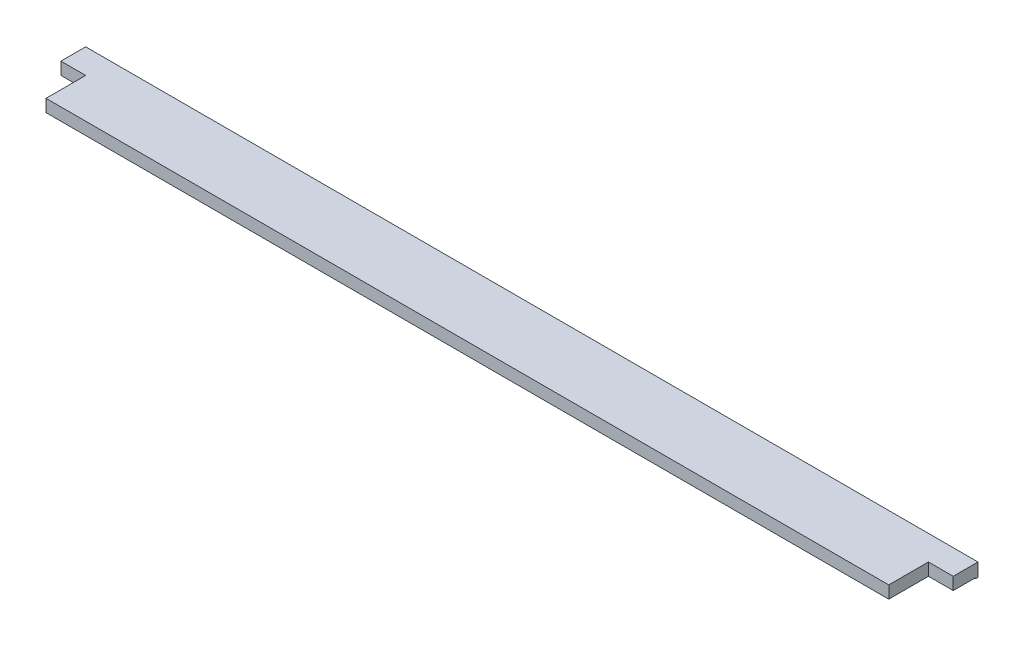
ISO-10303-21;
HEADER;
FILE_DESCRIPTION(('STEP AP214'),'2;1');
FILE_NAME('part.step','',(''),(''),'','','');
FILE_SCHEMA(('AUTOMOTIVE_DESIGN { 1 0 10303 214 1 1 1 1 }'));
ENDSEC;
DATA;
#1=APPLICATION_CONTEXT('core data for automotive mechanical design processes');
#2=APPLICATION_PROTOCOL_DEFINITION('international standard','automotive_design',2000,#1);
#3=PRODUCT_CONTEXT('',#1,'mechanical');
#4=PRODUCT('Part','Part','',(#3));
#5=PRODUCT_RELATED_PRODUCT_CATEGORY('part','',(#4));
#6=PRODUCT_DEFINITION_FORMATION('','',#4);
#7=PRODUCT_DEFINITION_CONTEXT('part definition',#1,'design');
#8=PRODUCT_DEFINITION('design','',#6,#7);
#9=PRODUCT_DEFINITION_SHAPE('','',#8);
#10=(LENGTH_UNIT() NAMED_UNIT(*) SI_UNIT(.MILLI.,.METRE.));
#11=(NAMED_UNIT(*) PLANE_ANGLE_UNIT() SI_UNIT($,.RADIAN.));
#12=(NAMED_UNIT(*) SI_UNIT($,.STERADIAN.) SOLID_ANGLE_UNIT());
#13=UNCERTAINTY_MEASURE_WITH_UNIT(LENGTH_MEASURE(1.E-05),#10,'distance_accuracy_value','');
#14=(GEOMETRIC_REPRESENTATION_CONTEXT(3) GLOBAL_UNCERTAINTY_ASSIGNED_CONTEXT((#13)) GLOBAL_UNIT_ASSIGNED_CONTEXT((#10,
#11,#12)) REPRESENTATION_CONTEXT('',''));
#15=CARTESIAN_POINT('',(0.,0.,0.));
#16=DIRECTION('',(0.,0.,1.));
#17=DIRECTION('',(1.,0.,0.));
#18=AXIS2_PLACEMENT_3D('',#15,#16,#17);
#19=CARTESIAN_POINT('',(1800.,-25.,0.));
#20=DIRECTION('',(0.,0.,-1.));
#21=DIRECTION('',(-1.,0.,0.));
#22=AXIS2_PLACEMENT_3D('',#19,#20,#21);
#23=PLANE('',#22);
#24=DIRECTION('',(-1.,0.,0.));
#25=VECTOR('',#24,1.);
#26=CARTESIAN_POINT('',(1800.,0.,0.));
#27=LINE('',#26,#25);
#28=CARTESIAN_POINT('',(1750.,0.,0.));
#29=VERTEX_POINT('',#28);
#30=CARTESIAN_POINT('',(50.,0.,0.));
#31=VERTEX_POINT('',#30);
#32=EDGE_CURVE('E129',#29,#31,#27,.T.);
#33=ORIENTED_EDGE('',*,*,#32,.T.);
#34=DIRECTION('',(0.,1.,0.));
#35=VECTOR('',#34,1.);
#36=CARTESIAN_POINT('',(50.,-27.,0.));
#37=LINE('',#36,#35);
#38=CARTESIAN_POINT('',(50.,-25.,0.));
#39=VERTEX_POINT('',#38);
#40=EDGE_CURVE('E111',#39,#31,#37,.T.);
#41=ORIENTED_EDGE('',*,*,#40,.F.);
#42=DIRECTION('',(-1.,0.,0.));
#43=VECTOR('',#42,1.);
#44=CARTESIAN_POINT('',(1800.,-25.,0.));
#45=LINE('',#44,#43);
#46=CARTESIAN_POINT('',(1750.,-25.,0.));
#47=VERTEX_POINT('',#46);
#48=EDGE_CURVE('E154',#47,#39,#45,.T.);
#49=ORIENTED_EDGE('',*,*,#48,.F.);
#50=DIRECTION('',(0.,1.,0.));
#51=VECTOR('',#50,1.);
#52=CARTESIAN_POINT('',(1750.,-27.,0.));
#53=LINE('',#52,#51);
#54=EDGE_CURVE('E130',#47,#29,#53,.T.);
#55=ORIENTED_EDGE('',*,*,#54,.T.);
#56=EDGE_LOOP('',(#33,#41,#49,#55));
#57=FACE_BOUND('',#56,.T.);
#58=ADVANCED_FACE('F35',(#57),#23,.F.);
#59=CARTESIAN_POINT('',(1800.,-25.,-125.));
#60=DIRECTION('',(0.,1.,0.));
#61=DIRECTION('',(0.,0.,1.));
#62=AXIS2_PLACEMENT_3D('',#59,#60,#61);
#63=PLANE('',#62);
#64=DIRECTION('',(0.,0.,-1.));
#65=VECTOR('',#64,1.);
#66=CARTESIAN_POINT('',(50.,-25.,-125.));
#67=LINE('',#66,#65);
#68=CARTESIAN_POINT('',(50.,-25.,-80.));
#69=VERTEX_POINT('',#68);
#70=EDGE_CURVE('E117',#39,#69,#67,.T.);
#71=ORIENTED_EDGE('',*,*,#70,.T.);
#72=DIRECTION('',(-1.,0.,0.));
#73=VECTOR('',#72,1.);
#74=CARTESIAN_POINT('',(1800.,-25.,-80.));
#75=LINE('',#74,#73);
#76=CARTESIAN_POINT('',(0.,-25.,-80.));
#77=VERTEX_POINT('',#76);
#78=EDGE_CURVE('E157',#69,#77,#75,.T.);
#79=ORIENTED_EDGE('',*,*,#78,.T.);
#80=DIRECTION('',(0.,0.,-1.));
#81=VECTOR('',#80,1.);
#82=CARTESIAN_POINT('',(0.,-25.,-125.));
#83=LINE('',#82,#81);
#84=CARTESIAN_POINT('',(0.,-25.,-125.));
#85=VERTEX_POINT('',#84);
#86=EDGE_CURVE('E164',#77,#85,#83,.T.);
#87=ORIENTED_EDGE('',*,*,#86,.T.);
#88=DIRECTION('',(-1.,0.,0.));
#89=VECTOR('',#88,1.);
#90=CARTESIAN_POINT('',(1800.,-25.,-125.));
#91=LINE('',#90,#89);
#92=CARTESIAN_POINT('',(1800.,-25.,-125.));
#93=VERTEX_POINT('',#92);
#94=EDGE_CURVE('E151',#93,#85,#91,.T.);
#95=ORIENTED_EDGE('',*,*,#94,.F.);
#96=DIRECTION('',(0.,0.,-1.));
#97=VECTOR('',#96,1.);
#98=CARTESIAN_POINT('',(1800.,-25.,-125.));
#99=LINE('',#98,#97);
#100=CARTESIAN_POINT('',(1800.,-25.,-80.));
#101=VERTEX_POINT('',#100);
#102=EDGE_CURVE('E181',#101,#93,#99,.T.);
#103=ORIENTED_EDGE('',*,*,#102,.F.);
#104=DIRECTION('',(-1.,0.,0.));
#105=VECTOR('',#104,1.);
#106=CARTESIAN_POINT('',(1800.,-25.,-80.));
#107=LINE('',#106,#105);
#108=CARTESIAN_POINT('',(1750.,-25.,-80.));
#109=VERTEX_POINT('',#108);
#110=EDGE_CURVE('E49',#101,#109,#107,.T.);
#111=ORIENTED_EDGE('',*,*,#110,.T.);
#112=DIRECTION('',(0.,0.,1.));
#113=VECTOR('',#112,1.);
#114=CARTESIAN_POINT('',(1750.,-25.,-125.));
#115=LINE('',#114,#113);
#116=EDGE_CURVE('E173',#109,#47,#115,.T.);
#117=ORIENTED_EDGE('',*,*,#116,.T.);
#118=ORIENTED_EDGE('',*,*,#48,.T.);
#119=EDGE_LOOP('',(#71,#79,#87,#95,#103,#111,#117,#118));
#120=FACE_BOUND('',#119,.T.);
#121=ADVANCED_FACE('F162',(#120),#63,.F.);
#122=CARTESIAN_POINT('',(1800.,-27.,-125.));
#123=DIRECTION('',(0.,0.,-1.));
#124=DIRECTION('',(-1.,0.,0.));
#125=AXIS2_PLACEMENT_3D('',#122,#123,#124);
#126=PLANE('',#125);
#127=DIRECTION('',(0.,-1.,0.));
#128=VECTOR('',#127,1.);
#129=CARTESIAN_POINT('',(0.,-27.,-125.));
#130=LINE('',#129,#128);
#131=CARTESIAN_POINT('',(0.,-27.,-125.));
#132=VERTEX_POINT('',#131);
#133=EDGE_CURVE('E169',#85,#132,#130,.T.);
#134=ORIENTED_EDGE('',*,*,#133,.T.);
#135=DIRECTION('',(-1.,0.,0.));
#136=VECTOR('',#135,1.);
#137=CARTESIAN_POINT('',(1800.,-27.,-125.));
#138=LINE('',#137,#136);
#139=CARTESIAN_POINT('',(1800.,-27.,-125.));
#140=VERTEX_POINT('',#139);
#141=EDGE_CURVE('E148',#140,#132,#138,.T.);
#142=ORIENTED_EDGE('',*,*,#141,.F.);
#143=DIRECTION('',(0.,-1.,0.));
#144=VECTOR('',#143,1.);
#145=CARTESIAN_POINT('',(1800.,-27.,-125.));
#146=LINE('',#145,#144);
#147=EDGE_CURVE('E182',#93,#140,#146,.T.);
#148=ORIENTED_EDGE('',*,*,#147,.F.);
#149=ORIENTED_EDGE('',*,*,#94,.T.);
#150=EDGE_LOOP('',(#134,#142,#148,#149));
#151=FACE_BOUND('',#150,.T.);
#152=ADVANCED_FACE('F222',(#151),#126,.F.);
#153=CARTESIAN_POINT('',(1800.,-27.,-130.));
#154=DIRECTION('',(0.,1.,0.));
#155=DIRECTION('',(0.,0.,1.));
#156=AXIS2_PLACEMENT_3D('',#153,#154,#155);
#157=PLANE('',#156);
#158=DIRECTION('',(0.,0.,-1.));
#159=VECTOR('',#158,1.);
#160=CARTESIAN_POINT('',(0.,-27.,-130.));
#161=LINE('',#160,#159);
#162=CARTESIAN_POINT('',(0.,-27.,-130.));
#163=VERTEX_POINT('',#162);
#164=EDGE_CURVE('E171',#132,#163,#161,.T.);
#165=ORIENTED_EDGE('',*,*,#164,.T.);
#166=DIRECTION('',(-1.,0.,0.));
#167=VECTOR('',#166,1.);
#168=CARTESIAN_POINT('',(1800.,-27.,-130.));
#169=LINE('',#168,#167);
#170=CARTESIAN_POINT('',(1800.,-27.,-130.));
#171=VERTEX_POINT('',#170);
#172=EDGE_CURVE('E137',#171,#163,#169,.T.);
#173=ORIENTED_EDGE('',*,*,#172,.F.);
#174=DIRECTION('',(0.,0.,-1.));
#175=VECTOR('',#174,1.);
#176=CARTESIAN_POINT('',(1800.,-27.,-130.));
#177=LINE('',#176,#175);
#178=EDGE_CURVE('E186',#140,#171,#177,.T.);
#179=ORIENTED_EDGE('',*,*,#178,.F.);
#180=ORIENTED_EDGE('',*,*,#141,.T.);
#181=EDGE_LOOP('',(#165,#173,#179,#180));
#182=FACE_BOUND('',#181,.T.);
#183=ADVANCED_FACE('F226',(#182),#157,.F.);
#184=CARTESIAN_POINT('',(1800.,0.,-130.));
#185=DIRECTION('',(0.,0.,1.));
#186=DIRECTION('',(1.,0.,0.));
#187=AXIS2_PLACEMENT_3D('',#184,#185,#186);
#188=PLANE('',#187);
#189=DIRECTION('',(0.,1.,0.));
#190=VECTOR('',#189,1.);
#191=CARTESIAN_POINT('',(0.,0.,-130.));
#192=LINE('',#191,#190);
#193=CARTESIAN_POINT('',(0.,0.,-130.));
#194=VERTEX_POINT('',#193);
#195=EDGE_CURVE('E177',#163,#194,#192,.T.);
#196=ORIENTED_EDGE('',*,*,#195,.T.);
#197=DIRECTION('',(-1.,0.,0.));
#198=VECTOR('',#197,1.);
#199=CARTESIAN_POINT('',(1800.,0.,-130.));
#200=LINE('',#199,#198);
#201=CARTESIAN_POINT('',(1800.,0.,-130.));
#202=VERTEX_POINT('',#201);
#203=EDGE_CURVE('E133',#202,#194,#200,.T.);
#204=ORIENTED_EDGE('',*,*,#203,.F.);
#205=DIRECTION('',(0.,1.,0.));
#206=VECTOR('',#205,1.);
#207=CARTESIAN_POINT('',(1800.,0.,-130.));
#208=LINE('',#207,#206);
#209=EDGE_CURVE('E140',#171,#202,#208,.T.);
#210=ORIENTED_EDGE('',*,*,#209,.F.);
#211=ORIENTED_EDGE('',*,*,#172,.T.);
#212=EDGE_LOOP('',(#196,#204,#210,#211));
#213=FACE_BOUND('',#212,.T.);
#214=ADVANCED_FACE('F195',(#213),#188,.F.);
#215=CARTESIAN_POINT('',(1800.,0.,0.));
#216=DIRECTION('',(0.,-1.,0.));
#217=DIRECTION('',(0.,0.,-1.));
#218=AXIS2_PLACEMENT_3D('',#215,#216,#217);
#219=PLANE('',#218);
#220=DIRECTION('',(0.,0.,1.));
#221=VECTOR('',#220,1.);
#222=CARTESIAN_POINT('',(0.,0.,0.));
#223=LINE('',#222,#221);
#224=CARTESIAN_POINT('',(0.,0.,-80.));
#225=VERTEX_POINT('',#224);
#226=EDGE_CURVE('E143',#194,#225,#223,.T.);
#227=ORIENTED_EDGE('',*,*,#226,.T.);
#228=DIRECTION('',(-1.,0.,0.));
#229=VECTOR('',#228,1.);
#230=CARTESIAN_POINT('',(0.,0.,-80.));
#231=LINE('',#230,#229);
#232=CARTESIAN_POINT('',(50.,0.,-80.));
#233=VERTEX_POINT('',#232);
#234=EDGE_CURVE('E56',#233,#225,#231,.T.);
#235=ORIENTED_EDGE('',*,*,#234,.F.);
#236=DIRECTION('',(0.,0.,-1.));
#237=VECTOR('',#236,1.);
#238=CARTESIAN_POINT('',(50.,0.,0.));
#239=LINE('',#238,#237);
#240=EDGE_CURVE('E115',#31,#233,#239,.T.);
#241=ORIENTED_EDGE('',*,*,#240,.F.);
#242=ORIENTED_EDGE('',*,*,#32,.F.);
#243=DIRECTION('',(0.,0.,1.));
#244=VECTOR('',#243,1.);
#245=CARTESIAN_POINT('',(1750.,0.,0.));
#246=LINE('',#245,#244);
#247=CARTESIAN_POINT('',(1750.,0.,-80.));
#248=VERTEX_POINT('',#247);
#249=EDGE_CURVE('E199',#248,#29,#246,.T.);
#250=ORIENTED_EDGE('',*,*,#249,.F.);
#251=DIRECTION('',(-1.,0.,0.));
#252=VECTOR('',#251,1.);
#253=CARTESIAN_POINT('',(1800.,0.,-80.));
#254=LINE('',#253,#252);
#255=CARTESIAN_POINT('',(1800.,0.,-80.));
#256=VERTEX_POINT('',#255);
#257=EDGE_CURVE('E198',#256,#248,#254,.T.);
#258=ORIENTED_EDGE('',*,*,#257,.F.);
#259=DIRECTION('',(0.,0.,1.));
#260=VECTOR('',#259,1.);
#261=CARTESIAN_POINT('',(1800.,0.,0.));
#262=LINE('',#261,#260);
#263=EDGE_CURVE('E134',#202,#256,#262,.T.);
#264=ORIENTED_EDGE('',*,*,#263,.F.);
#265=ORIENTED_EDGE('',*,*,#203,.T.);
#266=EDGE_LOOP('',(#227,#235,#241,#242,#250,#258,#264,#265));
#267=FACE_BOUND('',#266,.T.);
#268=ADVANCED_FACE('F127',(#267),#219,.F.);
#269=CARTESIAN_POINT('',(1800.,0.,0.));
#270=DIRECTION('',(-1.,0.,0.));
#271=DIRECTION('',(0.,0.,1.));
#272=AXIS2_PLACEMENT_3D('',#269,#270,#271);
#273=PLANE('',#272);
#274=ORIENTED_EDGE('',*,*,#263,.T.);
#275=DIRECTION('',(0.,-1.,0.));
#276=VECTOR('',#275,1.);
#277=CARTESIAN_POINT('',(1800.,0.,-80.));
#278=LINE('',#277,#276);
#279=EDGE_CURVE('E11',#256,#101,#278,.T.);
#280=ORIENTED_EDGE('',*,*,#279,.T.);
#281=ORIENTED_EDGE('',*,*,#102,.T.);
#282=ORIENTED_EDGE('',*,*,#147,.T.);
#283=ORIENTED_EDGE('',*,*,#178,.T.);
#284=ORIENTED_EDGE('',*,*,#209,.T.);
#285=EDGE_LOOP('',(#274,#280,#281,#282,#283,#284));
#286=FACE_BOUND('',#285,.T.);
#287=ADVANCED_FACE('F191',(#286),#273,.F.);
#288=CARTESIAN_POINT('',(0.,0.,0.));
#289=DIRECTION('',(-1.,0.,0.));
#290=DIRECTION('',(0.,0.,1.));
#291=AXIS2_PLACEMENT_3D('',#288,#289,#290);
#292=PLANE('',#291);
#293=DIRECTION('',(0.,-1.,0.));
#294=VECTOR('',#293,1.);
#295=CARTESIAN_POINT('',(0.,0.,-80.));
#296=LINE('',#295,#294);
#297=EDGE_CURVE('E42',#225,#77,#296,.T.);
#298=ORIENTED_EDGE('',*,*,#297,.F.);
#299=ORIENTED_EDGE('',*,*,#226,.F.);
#300=ORIENTED_EDGE('',*,*,#195,.F.);
#301=ORIENTED_EDGE('',*,*,#164,.F.);
#302=ORIENTED_EDGE('',*,*,#133,.F.);
#303=ORIENTED_EDGE('',*,*,#86,.F.);
#304=EDGE_LOOP('',(#298,#299,#300,#301,#302,#303));
#305=FACE_BOUND('',#304,.T.);
#306=ADVANCED_FACE('F167',(#305),#292,.T.);
#307=CARTESIAN_POINT('',(50.,-27.,0.));
#308=DIRECTION('',(1.,0.,0.));
#309=DIRECTION('',(0.,0.,-1.));
#310=AXIS2_PLACEMENT_3D('',#307,#308,#309);
#311=PLANE('',#310);
#312=ORIENTED_EDGE('',*,*,#40,.T.);
#313=ORIENTED_EDGE('',*,*,#240,.T.);
#314=DIRECTION('',(0.,1.,0.));
#315=VECTOR('',#314,1.);
#316=CARTESIAN_POINT('',(50.,-27.,-80.));
#317=LINE('',#316,#315);
#318=EDGE_CURVE('E122',#69,#233,#317,.T.);
#319=ORIENTED_EDGE('',*,*,#318,.F.);
#320=ORIENTED_EDGE('',*,*,#70,.F.);
#321=EDGE_LOOP('',(#312,#313,#319,#320));
#322=FACE_BOUND('',#321,.T.);
#323=ADVANCED_FACE('F113',(#322),#311,.F.);
#324=CARTESIAN_POINT('',(0.,-27.,-80.));
#325=DIRECTION('',(0.,0.,-1.));
#326=DIRECTION('',(-1.,0.,0.));
#327=AXIS2_PLACEMENT_3D('',#324,#325,#326);
#328=PLANE('',#327);
#329=ORIENTED_EDGE('',*,*,#318,.T.);
#330=ORIENTED_EDGE('',*,*,#234,.T.);
#331=ORIENTED_EDGE('',*,*,#297,.T.);
#332=ORIENTED_EDGE('',*,*,#78,.F.);
#333=EDGE_LOOP('',(#329,#330,#331,#332));
#334=FACE_BOUND('',#333,.T.);
#335=ADVANCED_FACE('F156',(#334),#328,.F.);
#336=CARTESIAN_POINT('',(1750.,-27.,0.));
#337=DIRECTION('',(-1.,0.,0.));
#338=DIRECTION('',(0.,0.,1.));
#339=AXIS2_PLACEMENT_3D('',#336,#337,#338);
#340=PLANE('',#339);
#341=DIRECTION('',(0.,1.,0.));
#342=VECTOR('',#341,1.);
#343=CARTESIAN_POINT('',(1750.,-27.,-80.));
#344=LINE('',#343,#342);
#345=EDGE_CURVE('E201',#109,#248,#344,.T.);
#346=ORIENTED_EDGE('',*,*,#345,.T.);
#347=ORIENTED_EDGE('',*,*,#249,.T.);
#348=ORIENTED_EDGE('',*,*,#54,.F.);
#349=ORIENTED_EDGE('',*,*,#116,.F.);
#350=EDGE_LOOP('',(#346,#347,#348,#349));
#351=FACE_BOUND('',#350,.T.);
#352=ADVANCED_FACE('F209',(#351),#340,.F.);
#353=CARTESIAN_POINT('',(1800.,-27.,-80.));
#354=DIRECTION('',(0.,0.,-1.));
#355=DIRECTION('',(-1.,0.,0.));
#356=AXIS2_PLACEMENT_3D('',#353,#354,#355);
#357=PLANE('',#356);
#358=ORIENTED_EDGE('',*,*,#279,.F.);
#359=ORIENTED_EDGE('',*,*,#257,.T.);
#360=ORIENTED_EDGE('',*,*,#345,.F.);
#361=ORIENTED_EDGE('',*,*,#110,.F.);
#362=EDGE_LOOP('',(#358,#359,#360,#361));
#363=FACE_BOUND('',#362,.T.);
#364=ADVANCED_FACE('F210',(#363),#357,.F.);
#365=CLOSED_SHELL('',(#58,#121,#152,#183,#214,#268,#287,#306,#323,#335,#352,#364));
#366=MANIFOLD_SOLID_BREP('B2',#365);
#367=ADVANCED_BREP_SHAPE_REPRESENTATION('',(#18,#366),#14);
#368=SHAPE_DEFINITION_REPRESENTATION(#9,#367);
ENDSEC;
END-ISO-10303-21;
